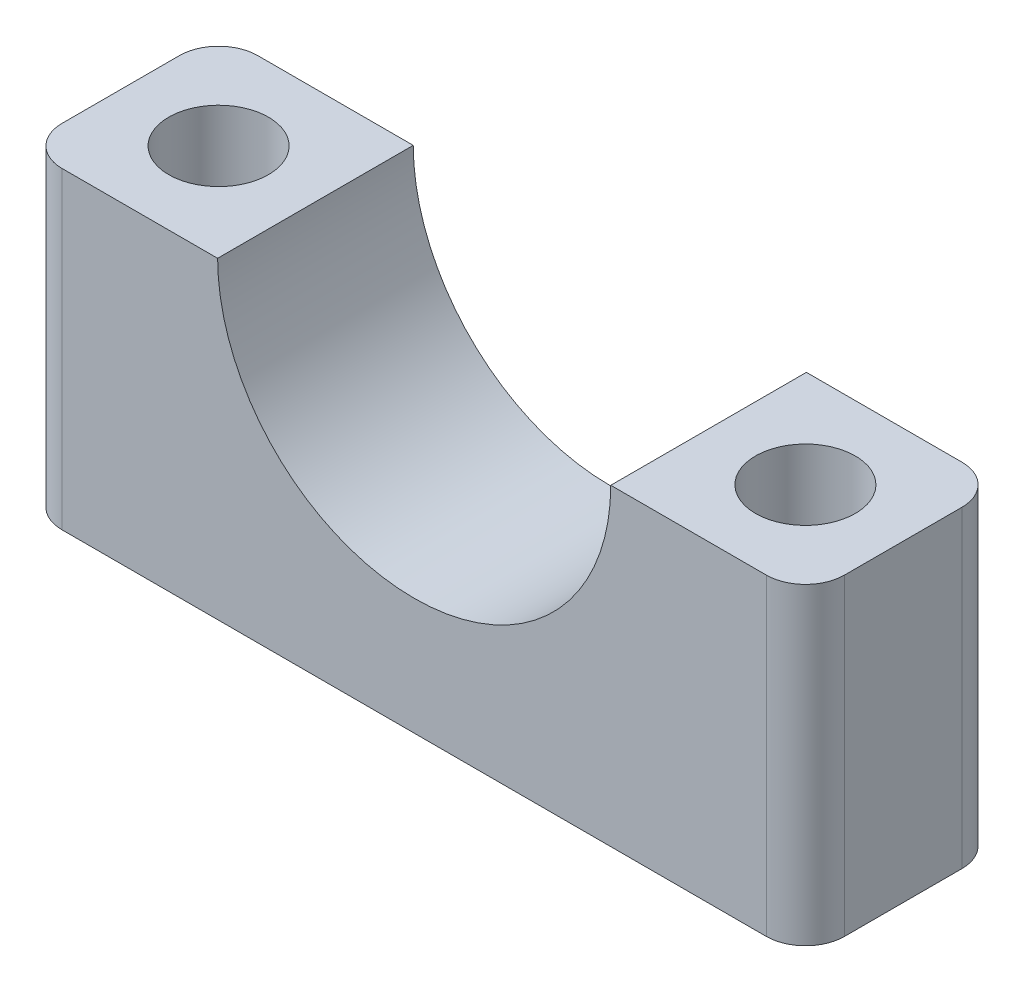
ISO-10303-21;
HEADER;
FILE_DESCRIPTION(('STEP AP214'),'2;1');
FILE_NAME('part.step','',(''),(''),'','','');
FILE_SCHEMA(('AUTOMOTIVE_DESIGN { 1 0 10303 214 1 1 1 1 }'));
ENDSEC;
DATA;
#1=APPLICATION_CONTEXT('core data for automotive mechanical design processes');
#2=APPLICATION_PROTOCOL_DEFINITION('international standard','automotive_design',2000,#1);
#3=PRODUCT_CONTEXT('',#1,'mechanical');
#4=PRODUCT('Part','Part','',(#3));
#5=PRODUCT_RELATED_PRODUCT_CATEGORY('part','',(#4));
#6=PRODUCT_DEFINITION_FORMATION('','',#4);
#7=PRODUCT_DEFINITION_CONTEXT('part definition',#1,'design');
#8=PRODUCT_DEFINITION('design','',#6,#7);
#9=PRODUCT_DEFINITION_SHAPE('','',#8);
#10=(LENGTH_UNIT() NAMED_UNIT(*) SI_UNIT(.MILLI.,.METRE.));
#11=(NAMED_UNIT(*) PLANE_ANGLE_UNIT() SI_UNIT($,.RADIAN.));
#12=(NAMED_UNIT(*) SI_UNIT($,.STERADIAN.) SOLID_ANGLE_UNIT());
#13=UNCERTAINTY_MEASURE_WITH_UNIT(LENGTH_MEASURE(1.E-05),#10,'distance_accuracy_value','');
#14=(GEOMETRIC_REPRESENTATION_CONTEXT(3) GLOBAL_UNCERTAINTY_ASSIGNED_CONTEXT((#13)) GLOBAL_UNIT_ASSIGNED_CONTEXT((#10,
#11,#12)) REPRESENTATION_CONTEXT('',''));
#15=CARTESIAN_POINT('',(0.,0.,0.));
#16=DIRECTION('',(0.,0.,1.));
#17=DIRECTION('',(1.,0.,0.));
#18=AXIS2_PLACEMENT_3D('',#15,#16,#17);
#19=CARTESIAN_POINT('',(-20.,8.,10.));
#20=DIRECTION('',(0.,-1.,0.));
#21=DIRECTION('',(0.,0.,-1.));
#22=AXIS2_PLACEMENT_3D('',#19,#20,#21);
#23=PLANE('',#22);
#24=CARTESIAN_POINT('',(15.,8.,5.00000000000001));
#25=DIRECTION('',(0.,1.,0.));
#26=DIRECTION('',(0.,0.,1.));
#27=AXIS2_PLACEMENT_3D('',#24,#25,#26);
#28=CIRCLE('',#27,2.55);
#29=CARTESIAN_POINT('',(15.,8.,7.55000000000001));
#30=VERTEX_POINT('',#29);
#31=EDGE_CURVE('E234',#30,#30,#28,.T.);
#32=ORIENTED_EDGE('',*,*,#31,.F.);
#33=EDGE_LOOP('',(#32));
#34=FACE_BOUND('',#33,.T.);
#35=DIRECTION('',(-1.,0.,0.));
#36=VECTOR('',#35,1.);
#37=CARTESIAN_POINT('',(-20.,8.,0.));
#38=LINE('',#37,#36);
#39=CARTESIAN_POINT('',(18.,8.,0.));
#40=VERTEX_POINT('',#39);
#41=CARTESIAN_POINT('',(10.0499800994828,8.,0.));
#42=VERTEX_POINT('',#41);
#43=EDGE_CURVE('E130',#40,#42,#38,.T.);
#44=ORIENTED_EDGE('',*,*,#43,.T.);
#45=DIRECTION('',(0.,0.,1.));
#46=VECTOR('',#45,1.);
#47=CARTESIAN_POINT('',(10.0499800994828,8.,0.));
#48=LINE('',#47,#46);
#49=CARTESIAN_POINT('',(10.0499800994828,8.,10.));
#50=VERTEX_POINT('',#49);
#51=EDGE_CURVE('E48',#42,#50,#48,.T.);
#52=ORIENTED_EDGE('',*,*,#51,.T.);
#53=DIRECTION('',(-1.,0.,0.));
#54=VECTOR('',#53,1.);
#55=CARTESIAN_POINT('',(-20.,8.,10.));
#56=LINE('',#55,#54);
#57=CARTESIAN_POINT('',(18.,8.,10.));
#58=VERTEX_POINT('',#57);
#59=EDGE_CURVE('E142',#58,#50,#56,.T.);
#60=ORIENTED_EDGE('',*,*,#59,.F.);
#61=CARTESIAN_POINT('',(18.,8.,8.));
#62=DIRECTION('',(0.,-1.,0.));
#63=DIRECTION('',(0.,0.,-1.));
#64=AXIS2_PLACEMENT_3D('',#61,#62,#63);
#65=CIRCLE('',#64,2.);
#66=CARTESIAN_POINT('',(20.,8.,8.));
#67=VERTEX_POINT('',#66);
#68=EDGE_CURVE('E160',#58,#67,#65,.F.);
#69=ORIENTED_EDGE('',*,*,#68,.T.);
#70=DIRECTION('',(0.,0.,-1.));
#71=VECTOR('',#70,1.);
#72=CARTESIAN_POINT('',(20.,8.,10.));
#73=LINE('',#72,#71);
#74=CARTESIAN_POINT('',(20.,8.,2.));
#75=VERTEX_POINT('',#74);
#76=EDGE_CURVE('E141',#67,#75,#73,.T.);
#77=ORIENTED_EDGE('',*,*,#76,.T.);
#78=CARTESIAN_POINT('',(18.,8.,2.));
#79=DIRECTION('',(0.,-1.,0.));
#80=DIRECTION('',(0.,0.,-1.));
#81=AXIS2_PLACEMENT_3D('',#78,#79,#80);
#82=CIRCLE('',#81,2.);
#83=EDGE_CURVE('E162',#75,#40,#82,.F.);
#84=ORIENTED_EDGE('',*,*,#83,.T.);
#85=EDGE_LOOP('',(#44,#52,#60,#69,#77,#84));
#86=FACE_BOUND('',#85,.T.);
#87=ADVANCED_FACE('F33',(#34,#86),#23,.F.);
#88=CARTESIAN_POINT('',(-20.,8.,10.));
#89=DIRECTION('',(1.,0.,0.));
#90=DIRECTION('',(0.,0.,-1.));
#91=AXIS2_PLACEMENT_3D('',#88,#89,#90);
#92=PLANE('',#91);
#93=DIRECTION('',(0.,0.,-1.));
#94=VECTOR('',#93,1.);
#95=CARTESIAN_POINT('',(-20.,-8.,10.));
#96=LINE('',#95,#94);
#97=CARTESIAN_POINT('',(-20.,-8.,8.));
#98=VERTEX_POINT('',#97);
#99=CARTESIAN_POINT('',(-20.,-8.,2.));
#100=VERTEX_POINT('',#99);
#101=EDGE_CURVE('E148',#98,#100,#96,.T.);
#102=ORIENTED_EDGE('',*,*,#101,.F.);
#103=DIRECTION('',(0.,-1.,0.));
#104=VECTOR('',#103,1.);
#105=CARTESIAN_POINT('',(-20.,8.,8.));
#106=LINE('',#105,#104);
#107=CARTESIAN_POINT('',(-20.,8.,8.));
#108=VERTEX_POINT('',#107);
#109=EDGE_CURVE('E11',#98,#108,#106,.F.);
#110=ORIENTED_EDGE('',*,*,#109,.T.);
#111=DIRECTION('',(0.,0.,-1.));
#112=VECTOR('',#111,1.);
#113=CARTESIAN_POINT('',(-20.,8.,10.));
#114=LINE('',#113,#112);
#115=CARTESIAN_POINT('',(-20.,8.,2.));
#116=VERTEX_POINT('',#115);
#117=EDGE_CURVE('E138',#108,#116,#114,.T.);
#118=ORIENTED_EDGE('',*,*,#117,.T.);
#119=DIRECTION('',(0.,-1.,0.));
#120=VECTOR('',#119,1.);
#121=CARTESIAN_POINT('',(-20.,8.,2.));
#122=LINE('',#121,#120);
#123=EDGE_CURVE('E41',#116,#100,#122,.T.);
#124=ORIENTED_EDGE('',*,*,#123,.T.);
#125=EDGE_LOOP('',(#102,#110,#118,#124));
#126=FACE_BOUND('',#125,.T.);
#127=ADVANCED_FACE('F181',(#126),#92,.F.);
#128=CARTESIAN_POINT('',(-20.,-8.,10.));
#129=DIRECTION('',(0.,1.,0.));
#130=DIRECTION('',(0.,0.,1.));
#131=AXIS2_PLACEMENT_3D('',#128,#129,#130);
#132=PLANE('',#131);
#133=CARTESIAN_POINT('',(15.,-8.,5.00000000000001));
#134=DIRECTION('',(0.,1.,0.));
#135=DIRECTION('',(0.,0.,1.));
#136=AXIS2_PLACEMENT_3D('',#133,#134,#135);
#137=CIRCLE('',#136,2.55);
#138=CARTESIAN_POINT('',(15.,-8.,7.55000000000001));
#139=VERTEX_POINT('',#138);
#140=EDGE_CURVE('E229',#139,#139,#137,.T.);
#141=ORIENTED_EDGE('',*,*,#140,.T.);
#142=EDGE_LOOP('',(#141));
#143=FACE_BOUND('',#142,.T.);
#144=CARTESIAN_POINT('',(-15.,-8.,5.00000000000001));
#145=DIRECTION('',(0.,1.,0.));
#146=DIRECTION('',(0.,0.,1.));
#147=AXIS2_PLACEMENT_3D('',#144,#145,#146);
#148=CIRCLE('',#147,2.55);
#149=CARTESIAN_POINT('',(-15.,-8.,7.55000000000001));
#150=VERTEX_POINT('',#149);
#151=EDGE_CURVE('E228',#150,#150,#148,.T.);
#152=ORIENTED_EDGE('',*,*,#151,.T.);
#153=EDGE_LOOP('',(#152));
#154=FACE_BOUND('',#153,.T.);
#155=DIRECTION('',(1.,0.,0.));
#156=VECTOR('',#155,1.);
#157=CARTESIAN_POINT('',(-20.,-8.,0.));
#158=LINE('',#157,#156);
#159=CARTESIAN_POINT('',(-18.,-8.,0.));
#160=VERTEX_POINT('',#159);
#161=CARTESIAN_POINT('',(18.,-8.,0.));
#162=VERTEX_POINT('',#161);
#163=EDGE_CURVE('E131',#160,#162,#158,.T.);
#164=ORIENTED_EDGE('',*,*,#163,.T.);
#165=CARTESIAN_POINT('',(18.,-8.,2.));
#166=DIRECTION('',(0.,1.,0.));
#167=DIRECTION('',(0.,0.,1.));
#168=AXIS2_PLACEMENT_3D('',#165,#166,#167);
#169=CIRCLE('',#168,2.);
#170=CARTESIAN_POINT('',(20.,-8.,2.));
#171=VERTEX_POINT('',#170);
#172=EDGE_CURVE('E172',#162,#171,#169,.F.);
#173=ORIENTED_EDGE('',*,*,#172,.T.);
#174=DIRECTION('',(0.,0.,-1.));
#175=VECTOR('',#174,1.);
#176=CARTESIAN_POINT('',(20.,-8.,10.));
#177=LINE('',#176,#175);
#178=CARTESIAN_POINT('',(20.,-8.,8.));
#179=VERTEX_POINT('',#178);
#180=EDGE_CURVE('E145',#179,#171,#177,.T.);
#181=ORIENTED_EDGE('',*,*,#180,.F.);
#182=CARTESIAN_POINT('',(18.,-8.,8.));
#183=DIRECTION('',(0.,1.,0.));
#184=DIRECTION('',(0.,0.,1.));
#185=AXIS2_PLACEMENT_3D('',#182,#183,#184);
#186=CIRCLE('',#185,2.);
#187=CARTESIAN_POINT('',(18.,-8.,10.));
#188=VERTEX_POINT('',#187);
#189=EDGE_CURVE('E170',#179,#188,#186,.F.);
#190=ORIENTED_EDGE('',*,*,#189,.T.);
#191=DIRECTION('',(1.,0.,0.));
#192=VECTOR('',#191,1.);
#193=CARTESIAN_POINT('',(-20.,-8.,10.));
#194=LINE('',#193,#192);
#195=CARTESIAN_POINT('',(-18.,-8.,10.));
#196=VERTEX_POINT('',#195);
#197=EDGE_CURVE('E133',#196,#188,#194,.T.);
#198=ORIENTED_EDGE('',*,*,#197,.F.);
#199=CARTESIAN_POINT('',(-18.,-8.,8.));
#200=DIRECTION('',(0.,1.,0.));
#201=DIRECTION('',(0.,0.,1.));
#202=AXIS2_PLACEMENT_3D('',#199,#200,#201);
#203=CIRCLE('',#202,2.);
#204=EDGE_CURVE('E168',#196,#98,#203,.F.);
#205=ORIENTED_EDGE('',*,*,#204,.T.);
#206=ORIENTED_EDGE('',*,*,#101,.T.);
#207=CARTESIAN_POINT('',(-18.,-8.,2.));
#208=DIRECTION('',(0.,1.,0.));
#209=DIRECTION('',(0.,0.,1.));
#210=AXIS2_PLACEMENT_3D('',#207,#208,#209);
#211=CIRCLE('',#210,2.);
#212=EDGE_CURVE('E56',#100,#160,#211,.F.);
#213=ORIENTED_EDGE('',*,*,#212,.T.);
#214=EDGE_LOOP('',(#164,#173,#181,#190,#198,#205,#206,#213));
#215=FACE_BOUND('',#214,.T.);
#216=ADVANCED_FACE('F185',(#143,#154,#215),#132,.F.);
#217=CARTESIAN_POINT('',(20.,8.,10.));
#218=DIRECTION('',(-1.,0.,0.));
#219=DIRECTION('',(0.,0.,1.));
#220=AXIS2_PLACEMENT_3D('',#217,#218,#219);
#221=PLANE('',#220);
#222=ORIENTED_EDGE('',*,*,#180,.T.);
#223=DIRECTION('',(0.,1.,0.));
#224=VECTOR('',#223,1.);
#225=CARTESIAN_POINT('',(20.,8.,2.));
#226=LINE('',#225,#224);
#227=EDGE_CURVE('E153',#171,#75,#226,.T.);
#228=ORIENTED_EDGE('',*,*,#227,.T.);
#229=ORIENTED_EDGE('',*,*,#76,.F.);
#230=DIRECTION('',(0.,1.,0.));
#231=VECTOR('',#230,1.);
#232=CARTESIAN_POINT('',(20.,-8.,8.));
#233=LINE('',#232,#231);
#234=EDGE_CURVE('E151',#67,#179,#233,.F.);
#235=ORIENTED_EDGE('',*,*,#234,.T.);
#236=EDGE_LOOP('',(#222,#228,#229,#235));
#237=FACE_BOUND('',#236,.T.);
#238=ADVANCED_FACE('F216',(#237),#221,.F.);
#239=CARTESIAN_POINT('',(-15.,8.,5.00000000000001));
#240=DIRECTION('',(0.,1.,0.));
#241=DIRECTION('',(0.,0.,1.));
#242=AXIS2_PLACEMENT_3D('',#239,#240,#241);
#243=CIRCLE('',#242,2.55);
#244=CARTESIAN_POINT('',(-15.,8.,7.55000000000001));
#245=VERTEX_POINT('',#244);
#246=EDGE_CURVE('E226',#245,#245,#243,.T.);
#247=ORIENTED_EDGE('',*,*,#246,.F.);
#248=EDGE_LOOP('',(#247));
#249=FACE_BOUND('',#248,.T.);
#250=CARTESIAN_POINT('',(-10.0499800994828,8.,10.));
#251=VERTEX_POINT('',#250);
#252=CARTESIAN_POINT('',(-18.,8.,10.));
#253=VERTEX_POINT('',#252);
#254=EDGE_CURVE('E124',#251,#253,#56,.T.);
#255=ORIENTED_EDGE('',*,*,#254,.F.);
#256=DIRECTION('',(0.,0.,1.));
#257=VECTOR('',#256,1.);
#258=CARTESIAN_POINT('',(-10.0499800994828,8.,0.));
#259=LINE('',#258,#257);
#260=CARTESIAN_POINT('',(-10.0499800994828,8.,0.));
#261=VERTEX_POINT('',#260);
#262=EDGE_CURVE('E110',#251,#261,#259,.F.);
#263=ORIENTED_EDGE('',*,*,#262,.T.);
#264=CARTESIAN_POINT('',(-18.,8.,0.));
#265=VERTEX_POINT('',#264);
#266=EDGE_CURVE('E121',#261,#265,#38,.T.);
#267=ORIENTED_EDGE('',*,*,#266,.T.);
#268=CARTESIAN_POINT('',(-18.,8.,2.));
#269=DIRECTION('',(0.,-1.,0.));
#270=DIRECTION('',(0.,0.,-1.));
#271=AXIS2_PLACEMENT_3D('',#268,#269,#270);
#272=CIRCLE('',#271,2.);
#273=EDGE_CURVE('E156',#265,#116,#272,.F.);
#274=ORIENTED_EDGE('',*,*,#273,.T.);
#275=ORIENTED_EDGE('',*,*,#117,.F.);
#276=CARTESIAN_POINT('',(-18.,8.,8.));
#277=DIRECTION('',(0.,-1.,0.));
#278=DIRECTION('',(0.,0.,-1.));
#279=AXIS2_PLACEMENT_3D('',#276,#277,#278);
#280=CIRCLE('',#279,2.);
#281=EDGE_CURVE('E158',#108,#253,#280,.F.);
#282=ORIENTED_EDGE('',*,*,#281,.T.);
#283=EDGE_LOOP('',(#255,#263,#267,#274,#275,#282));
#284=FACE_BOUND('',#283,.T.);
#285=ADVANCED_FACE('F120',(#249,#284),#23,.F.);
#286=CARTESIAN_POINT('',(0.,0.,10.));
#287=DIRECTION('',(0.,0.,1.));
#288=DIRECTION('',(1.,0.,0.));
#289=AXIS2_PLACEMENT_3D('',#286,#287,#288);
#290=PLANE('',#289);
#291=CARTESIAN_POINT('',(0.,8.02,10.));
#292=DIRECTION('',(0.,0.,1.));
#293=DIRECTION('',(1.,0.,0.));
#294=AXIS2_PLACEMENT_3D('',#291,#292,#293);
#295=CIRCLE('',#294,10.05);
#296=EDGE_CURVE('E116',#251,#50,#295,.T.);
#297=ORIENTED_EDGE('',*,*,#296,.F.);
#298=ORIENTED_EDGE('',*,*,#254,.T.);
#299=DIRECTION('',(0.,-1.,0.));
#300=VECTOR('',#299,1.);
#301=CARTESIAN_POINT('',(-18.,-8.,10.));
#302=LINE('',#301,#300);
#303=EDGE_CURVE('E174',#253,#196,#302,.T.);
#304=ORIENTED_EDGE('',*,*,#303,.T.);
#305=ORIENTED_EDGE('',*,*,#197,.T.);
#306=DIRECTION('',(0.,1.,0.));
#307=VECTOR('',#306,1.);
#308=CARTESIAN_POINT('',(18.,8.,10.));
#309=LINE('',#308,#307);
#310=EDGE_CURVE('E177',#188,#58,#309,.T.);
#311=ORIENTED_EDGE('',*,*,#310,.T.);
#312=ORIENTED_EDGE('',*,*,#59,.T.);
#313=EDGE_LOOP('',(#297,#298,#304,#305,#311,#312));
#314=FACE_BOUND('',#313,.T.);
#315=ADVANCED_FACE('F193',(#314),#290,.T.);
#316=CARTESIAN_POINT('',(0.,0.,0.));
#317=DIRECTION('',(0.,0.,1.));
#318=DIRECTION('',(1.,0.,0.));
#319=AXIS2_PLACEMENT_3D('',#316,#317,#318);
#320=PLANE('',#319);
#321=ORIENTED_EDGE('',*,*,#266,.F.);
#322=CARTESIAN_POINT('',(0.,8.02,0.));
#323=DIRECTION('',(0.,0.,1.));
#324=DIRECTION('',(1.,0.,0.));
#325=AXIS2_PLACEMENT_3D('',#322,#323,#324);
#326=CIRCLE('',#325,10.05);
#327=EDGE_CURVE('E107',#261,#42,#326,.T.);
#328=ORIENTED_EDGE('',*,*,#327,.T.);
#329=ORIENTED_EDGE('',*,*,#43,.F.);
#330=DIRECTION('',(0.,1.,0.));
#331=VECTOR('',#330,1.);
#332=CARTESIAN_POINT('',(18.,0.,0.));
#333=LINE('',#332,#331);
#334=EDGE_CURVE('E165',#40,#162,#333,.F.);
#335=ORIENTED_EDGE('',*,*,#334,.T.);
#336=ORIENTED_EDGE('',*,*,#163,.F.);
#337=DIRECTION('',(0.,-1.,0.));
#338=VECTOR('',#337,1.);
#339=CARTESIAN_POINT('',(-18.,0.,0.));
#340=LINE('',#339,#338);
#341=EDGE_CURVE('E128',#160,#265,#340,.F.);
#342=ORIENTED_EDGE('',*,*,#341,.T.);
#343=EDGE_LOOP('',(#321,#328,#329,#335,#336,#342));
#344=FACE_BOUND('',#343,.T.);
#345=ADVANCED_FACE('F126',(#344),#320,.F.);
#346=CARTESIAN_POINT('',(18.,8.,2.));
#347=DIRECTION('',(0.,1.,0.));
#348=DIRECTION('',(0.,0.,1.));
#349=AXIS2_PLACEMENT_3D('',#346,#347,#348);
#350=CYLINDRICAL_SURFACE('',#349,2.);
#351=ORIENTED_EDGE('',*,*,#172,.F.);
#352=ORIENTED_EDGE('',*,*,#334,.F.);
#353=ORIENTED_EDGE('',*,*,#83,.F.);
#354=ORIENTED_EDGE('',*,*,#227,.F.);
#355=EDGE_LOOP('',(#351,#352,#353,#354));
#356=FACE_BOUND('',#355,.T.);
#357=ADVANCED_FACE('F245',(#356),#350,.T.);
#358=CARTESIAN_POINT('',(18.,0.,8.));
#359=DIRECTION('',(0.,-1.,0.));
#360=DIRECTION('',(0.,0.,-1.));
#361=AXIS2_PLACEMENT_3D('',#358,#359,#360);
#362=CYLINDRICAL_SURFACE('',#361,2.);
#363=ORIENTED_EDGE('',*,*,#189,.F.);
#364=ORIENTED_EDGE('',*,*,#234,.F.);
#365=ORIENTED_EDGE('',*,*,#68,.F.);
#366=ORIENTED_EDGE('',*,*,#310,.F.);
#367=EDGE_LOOP('',(#363,#364,#365,#366));
#368=FACE_BOUND('',#367,.T.);
#369=ADVANCED_FACE('F203',(#368),#362,.T.);
#370=CARTESIAN_POINT('',(-18.,0.,8.));
#371=DIRECTION('',(0.,1.,0.));
#372=DIRECTION('',(0.,0.,1.));
#373=AXIS2_PLACEMENT_3D('',#370,#371,#372);
#374=CYLINDRICAL_SURFACE('',#373,2.);
#375=ORIENTED_EDGE('',*,*,#281,.F.);
#376=ORIENTED_EDGE('',*,*,#109,.F.);
#377=ORIENTED_EDGE('',*,*,#204,.F.);
#378=ORIENTED_EDGE('',*,*,#303,.F.);
#379=EDGE_LOOP('',(#375,#376,#377,#378));
#380=FACE_BOUND('',#379,.T.);
#381=ADVANCED_FACE('F191',(#380),#374,.T.);
#382=CARTESIAN_POINT('',(-18.,8.,2.));
#383=DIRECTION('',(0.,-1.,0.));
#384=DIRECTION('',(0.,0.,-1.));
#385=AXIS2_PLACEMENT_3D('',#382,#383,#384);
#386=CYLINDRICAL_SURFACE('',#385,2.);
#387=ORIENTED_EDGE('',*,*,#273,.F.);
#388=ORIENTED_EDGE('',*,*,#341,.F.);
#389=ORIENTED_EDGE('',*,*,#212,.F.);
#390=ORIENTED_EDGE('',*,*,#123,.F.);
#391=EDGE_LOOP('',(#387,#388,#389,#390));
#392=FACE_BOUND('',#391,.T.);
#393=ADVANCED_FACE('F35',(#392),#386,.T.);
#394=CARTESIAN_POINT('',(0.,8.02,0.));
#395=DIRECTION('',(0.,0.,1.));
#396=DIRECTION('',(1.,0.,0.));
#397=AXIS2_PLACEMENT_3D('',#394,#395,#396);
#398=CYLINDRICAL_SURFACE('',#397,10.05);
#399=ORIENTED_EDGE('',*,*,#327,.F.);
#400=ORIENTED_EDGE('',*,*,#262,.F.);
#401=ORIENTED_EDGE('',*,*,#296,.T.);
#402=ORIENTED_EDGE('',*,*,#51,.F.);
#403=EDGE_LOOP('',(#399,#400,#401,#402));
#404=FACE_BOUND('',#403,.T.);
#405=ADVANCED_FACE('F109',(#404),#398,.F.);
#406=CARTESIAN_POINT('',(-15.,-8.,5.00000000000001));
#407=DIRECTION('',(0.,1.,0.));
#408=DIRECTION('',(0.,0.,1.));
#409=AXIS2_PLACEMENT_3D('',#406,#407,#408);
#410=CYLINDRICAL_SURFACE('',#409,2.55);
#411=ORIENTED_EDGE('',*,*,#151,.F.);
#412=EDGE_LOOP('',(#411));
#413=FACE_BOUND('',#412,.T.);
#414=ORIENTED_EDGE('',*,*,#246,.T.);
#415=EDGE_LOOP('',(#414));
#416=FACE_BOUND('',#415,.T.);
#417=ADVANCED_FACE('F201',(#413,#416),#410,.F.);
#418=CARTESIAN_POINT('',(15.,-8.,5.00000000000001));
#419=DIRECTION('',(0.,1.,0.));
#420=DIRECTION('',(0.,0.,1.));
#421=AXIS2_PLACEMENT_3D('',#418,#419,#420);
#422=CYLINDRICAL_SURFACE('',#421,2.55);
#423=ORIENTED_EDGE('',*,*,#140,.F.);
#424=EDGE_LOOP('',(#423));
#425=FACE_BOUND('',#424,.T.);
#426=ORIENTED_EDGE('',*,*,#31,.T.);
#427=EDGE_LOOP('',(#426));
#428=FACE_BOUND('',#427,.T.);
#429=ADVANCED_FACE('F267',(#425,#428),#422,.F.);
#430=CLOSED_SHELL('',(#87,#127,#216,#238,#285,#315,#345,#357,#369,#381,#393,#405,#417,#429));
#431=MANIFOLD_SOLID_BREP('B2',#430);
#432=ADVANCED_BREP_SHAPE_REPRESENTATION('',(#18,#431),#14);
#433=SHAPE_DEFINITION_REPRESENTATION(#9,#432);
ENDSEC;
END-ISO-10303-21;
